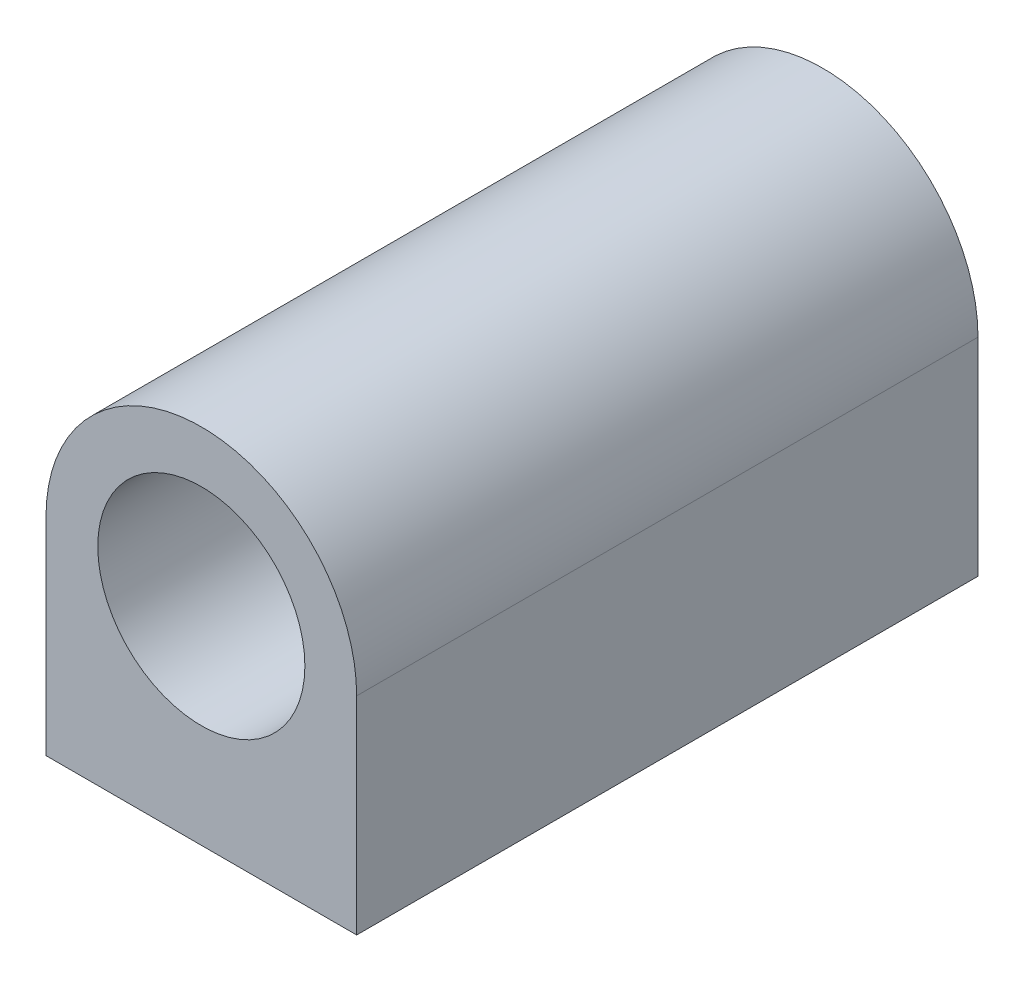
ISO-10303-21;
HEADER;
FILE_DESCRIPTION(('STEP AP214'),'2;1');
FILE_NAME('part.step','',(''),(''),'','','');
FILE_SCHEMA(('AUTOMOTIVE_DESIGN { 1 0 10303 214 1 1 1 1 }'));
ENDSEC;
DATA;
#1=APPLICATION_CONTEXT('core data for automotive mechanical design processes');
#2=APPLICATION_PROTOCOL_DEFINITION('international standard','automotive_design',2000,#1);
#3=PRODUCT_CONTEXT('',#1,'mechanical');
#4=PRODUCT('Part','Part','',(#3));
#5=PRODUCT_RELATED_PRODUCT_CATEGORY('part','',(#4));
#6=PRODUCT_DEFINITION_FORMATION('','',#4);
#7=PRODUCT_DEFINITION_CONTEXT('part definition',#1,'design');
#8=PRODUCT_DEFINITION('design','',#6,#7);
#9=PRODUCT_DEFINITION_SHAPE('','',#8);
#10=(LENGTH_UNIT() NAMED_UNIT(*) SI_UNIT(.MILLI.,.METRE.));
#11=(NAMED_UNIT(*) PLANE_ANGLE_UNIT() SI_UNIT($,.RADIAN.));
#12=(NAMED_UNIT(*) SI_UNIT($,.STERADIAN.) SOLID_ANGLE_UNIT());
#13=UNCERTAINTY_MEASURE_WITH_UNIT(LENGTH_MEASURE(1.E-05),#10,'distance_accuracy_value','');
#14=(GEOMETRIC_REPRESENTATION_CONTEXT(3) GLOBAL_UNCERTAINTY_ASSIGNED_CONTEXT((#13)) GLOBAL_UNIT_ASSIGNED_CONTEXT((#10,
#11,#12)) REPRESENTATION_CONTEXT('',''));
#15=CARTESIAN_POINT('',(0.,0.,0.));
#16=DIRECTION('',(0.,0.,1.));
#17=DIRECTION('',(1.,0.,0.));
#18=AXIS2_PLACEMENT_3D('',#15,#16,#17);
#19=CARTESIAN_POINT('',(-19.05,0.,38.1));
#20=DIRECTION('',(0.,1.,0.));
#21=DIRECTION('',(0.,0.,1.));
#22=AXIS2_PLACEMENT_3D('',#19,#20,#21);
#23=PLANE('',#22);
#24=CARTESIAN_POINT('',(-12.7,0.,-31.75));
#25=DIRECTION('',(0.,-1.,0.));
#26=DIRECTION('',(0.,0.,-1.));
#27=AXIS2_PLACEMENT_3D('',#24,#25,#26);
#28=CIRCLE('',#27,1.65100000000001);
#29=CARTESIAN_POINT('',(-12.7,0.,-33.401));
#30=VERTEX_POINT('',#29);
#31=EDGE_CURVE('E172',#30,#30,#28,.T.);
#32=ORIENTED_EDGE('',*,*,#31,.F.);
#33=EDGE_LOOP('',(#32));
#34=FACE_BOUND('',#33,.T.);
#35=CARTESIAN_POINT('',(-12.7,0.,31.75));
#36=DIRECTION('',(0.,-1.,0.));
#37=DIRECTION('',(0.,0.,-1.));
#38=AXIS2_PLACEMENT_3D('',#35,#36,#37);
#39=CIRCLE('',#38,1.65100000000001);
#40=CARTESIAN_POINT('',(-12.7,0.,30.099));
#41=VERTEX_POINT('',#40);
#42=EDGE_CURVE('E164',#41,#41,#39,.T.);
#43=ORIENTED_EDGE('',*,*,#42,.F.);
#44=EDGE_LOOP('',(#43));
#45=FACE_BOUND('',#44,.T.);
#46=CARTESIAN_POINT('',(12.7,0.,-31.75));
#47=DIRECTION('',(0.,-1.,0.));
#48=DIRECTION('',(0.,0.,-1.));
#49=AXIS2_PLACEMENT_3D('',#46,#47,#48);
#50=CIRCLE('',#49,1.65100000000001);
#51=CARTESIAN_POINT('',(12.7,0.,-33.401));
#52=VERTEX_POINT('',#51);
#53=EDGE_CURVE('E156',#52,#52,#50,.T.);
#54=ORIENTED_EDGE('',*,*,#53,.F.);
#55=EDGE_LOOP('',(#54));
#56=FACE_BOUND('',#55,.T.);
#57=DIRECTION('',(1.,0.,0.));
#58=VECTOR('',#57,1.);
#59=CARTESIAN_POINT('',(-19.05,0.,-38.1));
#60=LINE('',#59,#58);
#61=CARTESIAN_POINT('',(-19.05,0.,-38.1));
#62=VERTEX_POINT('',#61);
#63=CARTESIAN_POINT('',(19.05,0.,-38.1));
#64=VERTEX_POINT('',#63);
#65=EDGE_CURVE('E80',#62,#64,#60,.T.);
#66=ORIENTED_EDGE('',*,*,#65,.T.);
#67=DIRECTION('',(0.,0.,-1.));
#68=VECTOR('',#67,1.);
#69=CARTESIAN_POINT('',(19.05,0.,38.1));
#70=LINE('',#69,#68);
#71=CARTESIAN_POINT('',(19.05,0.,38.1));
#72=VERTEX_POINT('',#71);
#73=EDGE_CURVE('E106',#72,#64,#70,.T.);
#74=ORIENTED_EDGE('',*,*,#73,.F.);
#75=DIRECTION('',(1.,0.,0.));
#76=VECTOR('',#75,1.);
#77=CARTESIAN_POINT('',(-19.05,0.,38.1));
#78=LINE('',#77,#76);
#79=CARTESIAN_POINT('',(-19.05,0.,38.1));
#80=VERTEX_POINT('',#79);
#81=EDGE_CURVE('E97',#80,#72,#78,.T.);
#82=ORIENTED_EDGE('',*,*,#81,.F.);
#83=DIRECTION('',(0.,0.,-1.));
#84=VECTOR('',#83,1.);
#85=CARTESIAN_POINT('',(-19.05,0.,38.1));
#86=LINE('',#85,#84);
#87=EDGE_CURVE('E55',#80,#62,#86,.T.);
#88=ORIENTED_EDGE('',*,*,#87,.T.);
#89=EDGE_LOOP('',(#66,#74,#82,#88));
#90=FACE_BOUND('',#89,.T.);
#91=CARTESIAN_POINT('',(12.7,0.,31.75));
#92=DIRECTION('',(0.,-1.,0.));
#93=DIRECTION('',(0.,0.,-1.));
#94=AXIS2_PLACEMENT_3D('',#91,#92,#93);
#95=CIRCLE('',#94,1.65100000000001);
#96=CARTESIAN_POINT('',(12.7,0.,30.099));
#97=VERTEX_POINT('',#96);
#98=EDGE_CURVE('E148',#97,#97,#95,.T.);
#99=ORIENTED_EDGE('',*,*,#98,.F.);
#100=EDGE_LOOP('',(#99));
#101=FACE_BOUND('',#100,.T.);
#102=ADVANCED_FACE('F45',(#34,#45,#56,#90,#101),#23,.F.);
#103=CARTESIAN_POINT('',(0.,25.4,38.1));
#104=DIRECTION('',(0.,0.,1.));
#105=DIRECTION('',(1.,0.,0.));
#106=AXIS2_PLACEMENT_3D('',#103,#104,#105);
#107=PLANE('',#106);
#108=CARTESIAN_POINT('',(0.,25.4,38.1));
#109=DIRECTION('',(0.,0.,1.));
#110=DIRECTION('',(1.,0.,0.));
#111=AXIS2_PLACEMENT_3D('',#108,#109,#110);
#112=CIRCLE('',#111,19.05);
#113=CARTESIAN_POINT('',(19.05,25.4,38.1));
#114=VERTEX_POINT('',#113);
#115=CARTESIAN_POINT('',(-19.05,25.4,38.1));
#116=VERTEX_POINT('',#115);
#117=EDGE_CURVE('E99',#114,#116,#112,.T.);
#118=ORIENTED_EDGE('',*,*,#117,.T.);
#119=DIRECTION('',(0.,-1.,0.));
#120=VECTOR('',#119,1.);
#121=CARTESIAN_POINT('',(-19.05,25.4,38.1));
#122=LINE('',#121,#120);
#123=EDGE_CURVE('E93',#116,#80,#122,.T.);
#124=ORIENTED_EDGE('',*,*,#123,.T.);
#125=ORIENTED_EDGE('',*,*,#81,.T.);
#126=DIRECTION('',(0.,1.,0.));
#127=VECTOR('',#126,1.);
#128=CARTESIAN_POINT('',(19.05,0.,38.1));
#129=LINE('',#128,#127);
#130=EDGE_CURVE('E63',#72,#114,#129,.T.);
#131=ORIENTED_EDGE('',*,*,#130,.T.);
#132=EDGE_LOOP('',(#118,#124,#125,#131));
#133=FACE_BOUND('',#132,.T.);
#134=CARTESIAN_POINT('',(0.,25.4,38.1));
#135=DIRECTION('',(0.,0.,1.));
#136=DIRECTION('',(1.,0.,0.));
#137=AXIS2_PLACEMENT_3D('',#134,#135,#136);
#138=CIRCLE('',#137,12.7);
#139=CARTESIAN_POINT('',(-12.7,25.4,38.1));
#140=VERTEX_POINT('',#139);
#141=EDGE_CURVE('E119',#140,#140,#138,.T.);
#142=ORIENTED_EDGE('',*,*,#141,.F.);
#143=EDGE_LOOP('',(#142));
#144=FACE_BOUND('',#143,.T.);
#145=ADVANCED_FACE('F94',(#133,#144),#107,.T.);
#146=CARTESIAN_POINT('',(0.,25.4,-38.1));
#147=DIRECTION('',(0.,0.,1.));
#148=DIRECTION('',(1.,0.,0.));
#149=AXIS2_PLACEMENT_3D('',#146,#147,#148);
#150=PLANE('',#149);
#151=CARTESIAN_POINT('',(0.,25.4,-38.1));
#152=DIRECTION('',(0.,0.,1.));
#153=DIRECTION('',(1.,0.,0.));
#154=AXIS2_PLACEMENT_3D('',#151,#152,#153);
#155=CIRCLE('',#154,19.05);
#156=CARTESIAN_POINT('',(19.05,25.4,-38.1));
#157=VERTEX_POINT('',#156);
#158=CARTESIAN_POINT('',(-19.05,25.4,-38.1));
#159=VERTEX_POINT('',#158);
#160=EDGE_CURVE('E115',#157,#159,#155,.T.);
#161=ORIENTED_EDGE('',*,*,#160,.F.);
#162=DIRECTION('',(0.,1.,0.));
#163=VECTOR('',#162,1.);
#164=CARTESIAN_POINT('',(19.05,0.,-38.1));
#165=LINE('',#164,#163);
#166=EDGE_CURVE('E86',#64,#157,#165,.T.);
#167=ORIENTED_EDGE('',*,*,#166,.F.);
#168=ORIENTED_EDGE('',*,*,#65,.F.);
#169=DIRECTION('',(0.,-1.,0.));
#170=VECTOR('',#169,1.);
#171=CARTESIAN_POINT('',(-19.05,25.4,-38.1));
#172=LINE('',#171,#170);
#173=EDGE_CURVE('E104',#159,#62,#172,.T.);
#174=ORIENTED_EDGE('',*,*,#173,.F.);
#175=EDGE_LOOP('',(#161,#167,#168,#174));
#176=FACE_BOUND('',#175,.T.);
#177=CARTESIAN_POINT('',(0.,25.4,-38.1));
#178=DIRECTION('',(0.,0.,1.));
#179=DIRECTION('',(1.,0.,0.));
#180=AXIS2_PLACEMENT_3D('',#177,#178,#179);
#181=CIRCLE('',#180,12.7);
#182=CARTESIAN_POINT('',(-12.7,25.4,-38.1));
#183=VERTEX_POINT('',#182);
#184=EDGE_CURVE('E137',#183,#183,#181,.T.);
#185=ORIENTED_EDGE('',*,*,#184,.T.);
#186=EDGE_LOOP('',(#185));
#187=FACE_BOUND('',#186,.T.);
#188=ADVANCED_FACE('F132',(#176,#187),#150,.F.);
#189=CARTESIAN_POINT('',(0.,25.4,38.1));
#190=DIRECTION('',(0.,0.,-1.));
#191=DIRECTION('',(-1.,0.,0.));
#192=AXIS2_PLACEMENT_3D('',#189,#190,#191);
#193=CYLINDRICAL_SURFACE('',#192,19.05);
#194=ORIENTED_EDGE('',*,*,#160,.T.);
#195=DIRECTION('',(0.,0.,-1.));
#196=VECTOR('',#195,1.);
#197=CARTESIAN_POINT('',(-19.05,25.4,38.1));
#198=LINE('',#197,#196);
#199=EDGE_CURVE('E11',#116,#159,#198,.T.);
#200=ORIENTED_EDGE('',*,*,#199,.F.);
#201=ORIENTED_EDGE('',*,*,#117,.F.);
#202=DIRECTION('',(0.,0.,-1.));
#203=VECTOR('',#202,1.);
#204=CARTESIAN_POINT('',(19.05,25.4,38.1));
#205=LINE('',#204,#203);
#206=EDGE_CURVE('E111',#114,#157,#205,.T.);
#207=ORIENTED_EDGE('',*,*,#206,.T.);
#208=EDGE_LOOP('',(#194,#200,#201,#207));
#209=FACE_BOUND('',#208,.T.);
#210=ADVANCED_FACE('F47',(#209),#193,.T.);
#211=CARTESIAN_POINT('',(-19.05,25.4,38.1));
#212=DIRECTION('',(1.,0.,0.));
#213=DIRECTION('',(0.,0.,-1.));
#214=AXIS2_PLACEMENT_3D('',#211,#212,#213);
#215=PLANE('',#214);
#216=ORIENTED_EDGE('',*,*,#173,.T.);
#217=ORIENTED_EDGE('',*,*,#87,.F.);
#218=ORIENTED_EDGE('',*,*,#123,.F.);
#219=ORIENTED_EDGE('',*,*,#199,.T.);
#220=EDGE_LOOP('',(#216,#217,#218,#219));
#221=FACE_BOUND('',#220,.T.);
#222=ADVANCED_FACE('F103',(#221),#215,.F.);
#223=CARTESIAN_POINT('',(19.05,0.,38.1));
#224=DIRECTION('',(-1.,0.,0.));
#225=DIRECTION('',(0.,0.,1.));
#226=AXIS2_PLACEMENT_3D('',#223,#224,#225);
#227=PLANE('',#226);
#228=ORIENTED_EDGE('',*,*,#166,.T.);
#229=ORIENTED_EDGE('',*,*,#206,.F.);
#230=ORIENTED_EDGE('',*,*,#130,.F.);
#231=ORIENTED_EDGE('',*,*,#73,.T.);
#232=EDGE_LOOP('',(#228,#229,#230,#231));
#233=FACE_BOUND('',#232,.T.);
#234=ADVANCED_FACE('F129',(#233),#227,.F.);
#235=CARTESIAN_POINT('',(0.,25.4,38.1));
#236=DIRECTION('',(0.,0.,-1.));
#237=DIRECTION('',(-1.,0.,0.));
#238=AXIS2_PLACEMENT_3D('',#235,#236,#237);
#239=CYLINDRICAL_SURFACE('',#238,12.7);
#240=CARTESIAN_POINT('',(-12.7,25.4,38.1));
#241=CARTESIAN_POINT('',(-12.7,25.4,37.30625));
#242=CARTESIAN_POINT('',(-12.7,25.4,36.5125));
#243=CARTESIAN_POINT('',(-12.7,25.4,34.925));
#244=CARTESIAN_POINT('',(-12.7,25.4,34.13125));
#245=CARTESIAN_POINT('',(-12.7,25.4,32.54375));
#246=CARTESIAN_POINT('',(-12.7,25.4,31.75));
#247=CARTESIAN_POINT('',(-12.7,25.4,30.1625));
#248=CARTESIAN_POINT('',(-12.7,25.4,29.36875));
#249=CARTESIAN_POINT('',(-12.7,25.4,27.78125));
#250=CARTESIAN_POINT('',(-12.7,25.4,26.9875));
#251=CARTESIAN_POINT('',(-12.7,25.4,25.4));
#252=CARTESIAN_POINT('',(-12.7,25.4,24.60625));
#253=CARTESIAN_POINT('',(-12.7,25.4,23.01875));
#254=CARTESIAN_POINT('',(-12.7,25.4,22.225));
#255=CARTESIAN_POINT('',(-12.7,25.4,20.6375));
#256=CARTESIAN_POINT('',(-12.7,25.4,19.84375));
#257=CARTESIAN_POINT('',(-12.7,25.4,18.25625));
#258=CARTESIAN_POINT('',(-12.7,25.4,17.4625));
#259=CARTESIAN_POINT('',(-12.7,25.4,15.875));
#260=CARTESIAN_POINT('',(-12.7,25.4,15.08125));
#261=CARTESIAN_POINT('',(-12.7,25.4,13.49375));
#262=CARTESIAN_POINT('',(-12.7,25.4,12.7));
#263=CARTESIAN_POINT('',(-12.7,25.4,11.1125));
#264=CARTESIAN_POINT('',(-12.7,25.4,10.31875));
#265=CARTESIAN_POINT('',(-12.7,25.4,8.73124999999999));
#266=CARTESIAN_POINT('',(-12.7,25.4,7.93749999999999));
#267=CARTESIAN_POINT('',(-12.7,25.4,6.34999999999999));
#268=CARTESIAN_POINT('',(-12.7,25.4,5.55625));
#269=CARTESIAN_POINT('',(-12.7,25.4,3.96875));
#270=CARTESIAN_POINT('',(-12.7,25.4,3.17499999999999));
#271=CARTESIAN_POINT('',(-12.7,25.4,1.58749999999999));
#272=CARTESIAN_POINT('',(-12.7,25.4,0.793749999999994));
#273=CARTESIAN_POINT('',(-12.7,25.4,-0.793750000000007));
#274=CARTESIAN_POINT('',(-12.7,25.4,-1.58750000000001));
#275=CARTESIAN_POINT('',(-12.7,25.4,-3.17500000000001));
#276=CARTESIAN_POINT('',(-12.7,25.4,-3.96875000000001));
#277=CARTESIAN_POINT('',(-12.7,25.4,-5.55625000000001));
#278=CARTESIAN_POINT('',(-12.7,25.4,-6.35000000000001));
#279=CARTESIAN_POINT('',(-12.7,25.4,-7.93750000000001));
#280=CARTESIAN_POINT('',(-12.7,25.4,-8.73125000000001));
#281=CARTESIAN_POINT('',(-12.7,25.4,-10.31875));
#282=CARTESIAN_POINT('',(-12.7,25.4,-11.1125));
#283=CARTESIAN_POINT('',(-12.7,25.4,-12.7));
#284=CARTESIAN_POINT('',(-12.7,25.4,-13.49375));
#285=CARTESIAN_POINT('',(-12.7,25.4,-15.08125));
#286=CARTESIAN_POINT('',(-12.7,25.4,-15.875));
#287=CARTESIAN_POINT('',(-12.7,25.4,-17.4625));
#288=CARTESIAN_POINT('',(-12.7,25.4,-18.25625));
#289=CARTESIAN_POINT('',(-12.7,25.4,-19.84375));
#290=CARTESIAN_POINT('',(-12.7,25.4,-20.6375));
#291=CARTESIAN_POINT('',(-12.7,25.4,-22.225));
#292=CARTESIAN_POINT('',(-12.7,25.4,-23.01875));
#293=CARTESIAN_POINT('',(-12.7,25.4,-24.60625));
#294=CARTESIAN_POINT('',(-12.7,25.4,-25.4));
#295=CARTESIAN_POINT('',(-12.7,25.4,-26.9875));
#296=CARTESIAN_POINT('',(-12.7,25.4,-27.78125));
#297=CARTESIAN_POINT('',(-12.7,25.4,-29.36875));
#298=CARTESIAN_POINT('',(-12.7,25.4,-30.1625));
#299=CARTESIAN_POINT('',(-12.7,25.4,-31.75));
#300=CARTESIAN_POINT('',(-12.7,25.4,-32.54375));
#301=CARTESIAN_POINT('',(-12.7,25.4,-34.13125));
#302=CARTESIAN_POINT('',(-12.7,25.4,-34.925));
#303=CARTESIAN_POINT('',(-12.7,25.4,-36.5125));
#304=CARTESIAN_POINT('',(-12.7,25.4,-37.30625));
#305=CARTESIAN_POINT('',(-12.7,25.4,-38.1));
#306=B_SPLINE_CURVE_WITH_KNOTS('',3,(#240,#241,#242,#243,#244,#245,#246,#247,#248,#249,#250,
#251,#252,#253,#254,#255,#256,#257,#258,#259,#260,#261,#262,#263,#264,#265,#266,#267,#268,#269,
#270,#271,#272,#273,#274,#275,#276,#277,#278,#279,#280,#281,#282,#283,#284,#285,#286,#287,#288,
#289,#290,#291,#292,#293,#294,#295,#296,#297,#298,#299,#300,#301,#302,#303,#304,#305),
.UNSPECIFIED.,.F.,.F.,(4,2,2,2,2,2,2,2,2,2,2,2,2,2,2,2,2,2,2,2,2,2,2,2,2,2,2,2,2,2,2,2,4),(0.,
2.38124999999999,4.7625,7.14375,9.525,11.90625,14.2875,16.66875,19.05,21.43125,23.8125,26.19375,
28.575,30.95625,33.3375,35.71875,38.1,40.48125,42.8625,45.24375,47.625,50.00625,52.3875,
54.76875,57.15,59.53125,61.9125,64.29375,66.675,69.05625,71.4375,73.81875,76.2),.UNSPECIFIED.);
#307=EDGE_CURVE('BSEAM211',#140,#183,#306,.T.);
#308=ORIENTED_EDGE('',*,*,#141,.T.);
#309=ORIENTED_EDGE('',*,*,#184,.F.);
#310=ORIENTED_EDGE('',*,*,#307,.T.);
#311=ORIENTED_EDGE('',*,*,#307,.F.);
#312=EDGE_LOOP('',(#308,#310,#309,#311));
#313=FACE_BOUND('',#312,.T.);
#314=ADVANCED_FACE('F211',(#313),#239,.F.);
#315=CARTESIAN_POINT('',(12.7,12.7,31.75));
#316=DIRECTION('',(0.,1.,0.));
#317=DIRECTION('',(0.,0.,1.));
#318=AXIS2_PLACEMENT_3D('',#315,#316,#317);
#319=PLANE('',#318);
#320=CARTESIAN_POINT('',(12.7,12.7,31.75));
#321=DIRECTION('',(0.,-1.,0.));
#322=DIRECTION('',(0.,0.,-1.));
#323=AXIS2_PLACEMENT_3D('',#320,#321,#322);
#324=CIRCLE('',#323,1.65100000000001);
#325=CARTESIAN_POINT('',(12.7,12.7,30.099));
#326=VERTEX_POINT('',#325);
#327=EDGE_CURVE('E141',#326,#326,#324,.T.);
#328=ORIENTED_EDGE('',*,*,#327,.T.);
#329=EDGE_LOOP('',(#328));
#330=FACE_BOUND('',#329,.T.);
#331=ADVANCED_FACE('F207',(#330),#319,.F.);
#332=CARTESIAN_POINT('',(12.7,0.,31.75));
#333=DIRECTION('',(0.,-1.,0.));
#334=DIRECTION('',(0.,0.,-1.));
#335=AXIS2_PLACEMENT_3D('',#332,#333,#334);
#336=CYLINDRICAL_SURFACE('',#335,1.65100000000001);
#337=ORIENTED_EDGE('',*,*,#327,.F.);
#338=EDGE_LOOP('',(#337));
#339=FACE_BOUND('',#338,.T.);
#340=ORIENTED_EDGE('',*,*,#98,.T.);
#341=EDGE_LOOP('',(#340));
#342=FACE_BOUND('',#341,.T.);
#343=ADVANCED_FACE('F199',(#339,#342),#336,.F.);
#344=CARTESIAN_POINT('',(12.7,12.7,-31.75));
#345=DIRECTION('',(0.,1.,0.));
#346=DIRECTION('',(0.,0.,1.));
#347=AXIS2_PLACEMENT_3D('',#344,#345,#346);
#348=PLANE('',#347);
#349=CARTESIAN_POINT('',(12.7,12.7,-31.75));
#350=DIRECTION('',(0.,-1.,0.));
#351=DIRECTION('',(0.,0.,-1.));
#352=AXIS2_PLACEMENT_3D('',#349,#350,#351);
#353=CIRCLE('',#352,1.65100000000001);
#354=CARTESIAN_POINT('',(12.7,12.7,-33.401));
#355=VERTEX_POINT('',#354);
#356=EDGE_CURVE('E152',#355,#355,#353,.T.);
#357=ORIENTED_EDGE('',*,*,#356,.T.);
#358=EDGE_LOOP('',(#357));
#359=FACE_BOUND('',#358,.T.);
#360=ADVANCED_FACE('F189',(#359),#348,.F.);
#361=CARTESIAN_POINT('',(12.7,0.,-31.75));
#362=DIRECTION('',(0.,-1.,0.));
#363=DIRECTION('',(0.,0.,-1.));
#364=AXIS2_PLACEMENT_3D('',#361,#362,#363);
#365=CYLINDRICAL_SURFACE('',#364,1.65100000000001);
#366=ORIENTED_EDGE('',*,*,#356,.F.);
#367=EDGE_LOOP('',(#366));
#368=FACE_BOUND('',#367,.T.);
#369=ORIENTED_EDGE('',*,*,#53,.T.);
#370=EDGE_LOOP('',(#369));
#371=FACE_BOUND('',#370,.T.);
#372=ADVANCED_FACE('F186',(#368,#371),#365,.F.);
#373=CARTESIAN_POINT('',(-12.7,12.7,31.75));
#374=DIRECTION('',(0.,1.,0.));
#375=DIRECTION('',(0.,0.,1.));
#376=AXIS2_PLACEMENT_3D('',#373,#374,#375);
#377=PLANE('',#376);
#378=CARTESIAN_POINT('',(-12.7,12.7,31.75));
#379=DIRECTION('',(0.,-1.,0.));
#380=DIRECTION('',(0.,0.,-1.));
#381=AXIS2_PLACEMENT_3D('',#378,#379,#380);
#382=CIRCLE('',#381,1.65100000000001);
#383=CARTESIAN_POINT('',(-12.7,12.7,30.099));
#384=VERTEX_POINT('',#383);
#385=EDGE_CURVE('E160',#384,#384,#382,.T.);
#386=ORIENTED_EDGE('',*,*,#385,.T.);
#387=EDGE_LOOP('',(#386));
#388=FACE_BOUND('',#387,.T.);
#389=ADVANCED_FACE('F188',(#388),#377,.F.);
#390=CARTESIAN_POINT('',(-12.7,0.,31.75));
#391=DIRECTION('',(0.,-1.,0.));
#392=DIRECTION('',(0.,0.,-1.));
#393=AXIS2_PLACEMENT_3D('',#390,#391,#392);
#394=CYLINDRICAL_SURFACE('',#393,1.65100000000001);
#395=ORIENTED_EDGE('',*,*,#385,.F.);
#396=EDGE_LOOP('',(#395));
#397=FACE_BOUND('',#396,.T.);
#398=ORIENTED_EDGE('',*,*,#42,.T.);
#399=EDGE_LOOP('',(#398));
#400=FACE_BOUND('',#399,.T.);
#401=ADVANCED_FACE('F196',(#397,#400),#394,.F.);
#402=CARTESIAN_POINT('',(-12.7,12.7,-31.75));
#403=DIRECTION('',(0.,1.,0.));
#404=DIRECTION('',(0.,0.,1.));
#405=AXIS2_PLACEMENT_3D('',#402,#403,#404);
#406=PLANE('',#405);
#407=CARTESIAN_POINT('',(-12.7,12.7,-31.75));
#408=DIRECTION('',(0.,-1.,0.));
#409=DIRECTION('',(0.,0.,-1.));
#410=AXIS2_PLACEMENT_3D('',#407,#408,#409);
#411=CIRCLE('',#410,1.65100000000001);
#412=CARTESIAN_POINT('',(-12.7,12.7,-33.401));
#413=VERTEX_POINT('',#412);
#414=EDGE_CURVE('E168',#413,#413,#411,.T.);
#415=ORIENTED_EDGE('',*,*,#414,.T.);
#416=EDGE_LOOP('',(#415));
#417=FACE_BOUND('',#416,.T.);
#418=ADVANCED_FACE('F292',(#417),#406,.F.);
#419=CARTESIAN_POINT('',(-12.7,0.,-31.75));
#420=DIRECTION('',(0.,-1.,0.));
#421=DIRECTION('',(0.,0.,-1.));
#422=AXIS2_PLACEMENT_3D('',#419,#420,#421);
#423=CYLINDRICAL_SURFACE('',#422,1.65100000000001);
#424=ORIENTED_EDGE('',*,*,#414,.F.);
#425=EDGE_LOOP('',(#424));
#426=FACE_BOUND('',#425,.T.);
#427=ORIENTED_EDGE('',*,*,#31,.T.);
#428=EDGE_LOOP('',(#427));
#429=FACE_BOUND('',#428,.T.);
#430=ADVANCED_FACE('F177',(#426,#429),#423,.F.);
#431=CLOSED_SHELL('',(#102,#145,#188,#210,#222,#234,#314,#331,#343,#360,#372,#389,#401,#418,#430));
#432=MANIFOLD_SOLID_BREP('B2',#431);
#433=ADVANCED_BREP_SHAPE_REPRESENTATION('',(#18,#432),#14);
#434=SHAPE_DEFINITION_REPRESENTATION(#9,#433);
ENDSEC;
END-ISO-10303-21;
